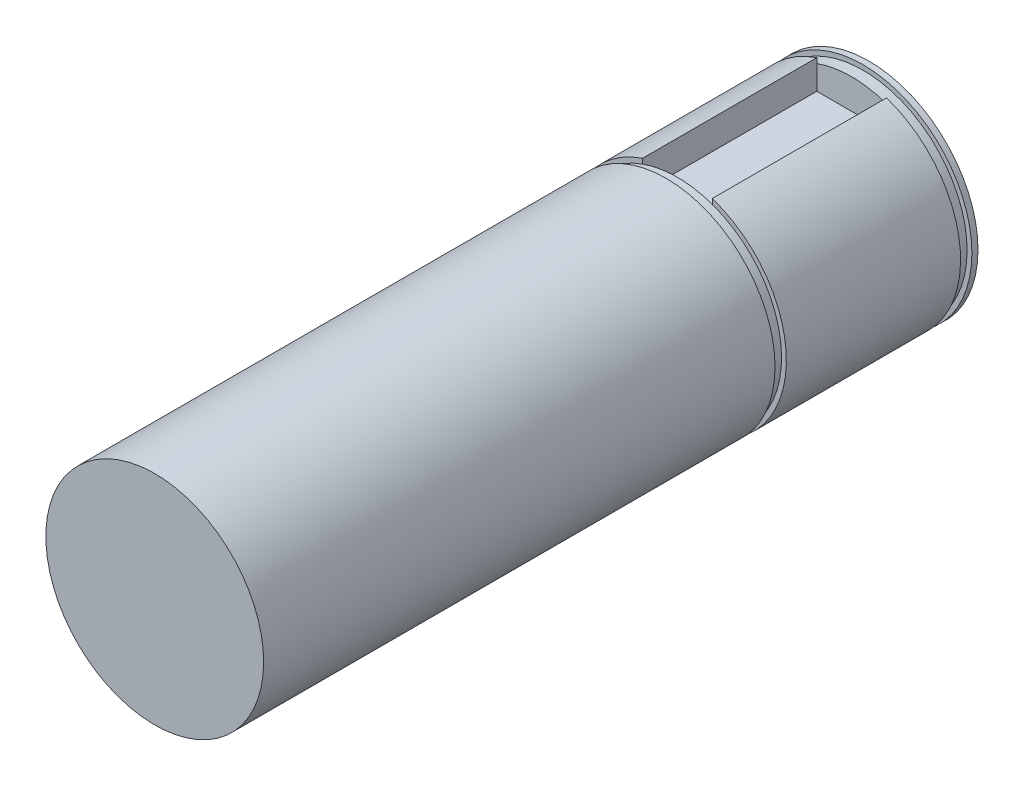
ISO-10303-21;
HEADER;
FILE_DESCRIPTION(('STEP AP214'),'2;1');
FILE_NAME('part.step','',(''),(''),'','','');
FILE_SCHEMA(('AUTOMOTIVE_DESIGN { 1 0 10303 214 1 1 1 1 }'));
ENDSEC;
DATA;
#1=APPLICATION_CONTEXT('core data for automotive mechanical design processes');
#2=APPLICATION_PROTOCOL_DEFINITION('international standard','automotive_design',2000,#1);
#3=PRODUCT_CONTEXT('',#1,'mechanical');
#4=PRODUCT('Part','Part','',(#3));
#5=PRODUCT_RELATED_PRODUCT_CATEGORY('part','',(#4));
#6=PRODUCT_DEFINITION_FORMATION('','',#4);
#7=PRODUCT_DEFINITION_CONTEXT('part definition',#1,'design');
#8=PRODUCT_DEFINITION('design','',#6,#7);
#9=PRODUCT_DEFINITION_SHAPE('','',#8);
#10=(LENGTH_UNIT() NAMED_UNIT(*) SI_UNIT(.MILLI.,.METRE.));
#11=(NAMED_UNIT(*) PLANE_ANGLE_UNIT() SI_UNIT($,.RADIAN.));
#12=(NAMED_UNIT(*) SI_UNIT($,.STERADIAN.) SOLID_ANGLE_UNIT());
#13=UNCERTAINTY_MEASURE_WITH_UNIT(LENGTH_MEASURE(1.E-05),#10,'distance_accuracy_value','');
#14=(GEOMETRIC_REPRESENTATION_CONTEXT(3) GLOBAL_UNCERTAINTY_ASSIGNED_CONTEXT((#13)) GLOBAL_UNIT_ASSIGNED_CONTEXT((#10,
#11,#12)) REPRESENTATION_CONTEXT('',''));
#15=CARTESIAN_POINT('',(0.,0.,0.));
#16=DIRECTION('',(0.,0.,1.));
#17=DIRECTION('',(1.,0.,0.));
#18=AXIS2_PLACEMENT_3D('',#15,#16,#17);
#19=CARTESIAN_POINT('',(0.,0.,-2.));
#20=DIRECTION('',(0.,0.,1.));
#21=DIRECTION('',(1.,0.,0.));
#22=AXIS2_PLACEMENT_3D('',#19,#20,#21);
#23=CYLINDRICAL_SURFACE('',#22,12.5);
#24=CARTESIAN_POINT('',(0.,0.,20.));
#25=DIRECTION('',(0.,0.,-1.));
#26=DIRECTION('',(-1.,0.,0.));
#27=AXIS2_PLACEMENT_3D('',#24,#25,#26);
#28=CIRCLE('',#27,12.5);
#29=CARTESIAN_POINT('',(4.,11.842719282327,20.));
#30=VERTEX_POINT('',#29);
#31=CARTESIAN_POINT('',(-4.,11.842719282327,20.));
#32=VERTEX_POINT('',#31);
#33=EDGE_CURVE('E88',#30,#32,#28,.T.);
#34=ORIENTED_EDGE('',*,*,#33,.T.);
#35=DIRECTION('',(0.,0.,-1.));
#36=VECTOR('',#35,1.);
#37=CARTESIAN_POINT('',(-4.,11.842719282327,20.));
#38=LINE('',#37,#36);
#39=CARTESIAN_POINT('',(-4.,11.842719282327,0.));
#40=VERTEX_POINT('',#39);
#41=EDGE_CURVE('E101',#32,#40,#38,.T.);
#42=ORIENTED_EDGE('',*,*,#41,.T.);
#43=CARTESIAN_POINT('',(0.,0.,0.));
#44=DIRECTION('',(0.,0.,-1.));
#45=DIRECTION('',(-1.,0.,0.));
#46=AXIS2_PLACEMENT_3D('',#43,#44,#45);
#47=CIRCLE('',#46,12.5);
#48=CARTESIAN_POINT('',(4.,11.842719282327,0.));
#49=VERTEX_POINT('',#48);
#50=EDGE_CURVE('E149',#49,#40,#47,.T.);
#51=ORIENTED_EDGE('',*,*,#50,.F.);
#52=DIRECTION('',(0.,0.,-1.));
#53=VECTOR('',#52,1.);
#54=CARTESIAN_POINT('',(4.,11.842719282327,20.));
#55=LINE('',#54,#53);
#56=EDGE_CURVE('E103',#30,#49,#55,.T.);
#57=ORIENTED_EDGE('',*,*,#56,.F.);
#58=EDGE_LOOP('',(#34,#42,#51,#57));
#59=FACE_BOUND('',#58,.T.);
#60=ADVANCED_FACE('F33',(#59),#23,.T.);
#61=CARTESIAN_POINT('',(-4.,8.5,20.));
#62=DIRECTION('',(-1.,0.,0.));
#63=DIRECTION('',(0.,0.,1.));
#64=AXIS2_PLACEMENT_3D('',#61,#62,#63);
#65=PLANE('',#64);
#66=DIRECTION('',(0.,1.,0.));
#67=VECTOR('',#66,1.);
#68=CARTESIAN_POINT('',(-4.,8.5,0.));
#69=LINE('',#68,#67);
#70=CARTESIAN_POINT('',(-4.,8.5,0.));
#71=VERTEX_POINT('',#70);
#72=CARTESIAN_POINT('',(-4.,11.2606616146655,0.));
#73=VERTEX_POINT('',#72);
#74=EDGE_CURVE('E116',#71,#73,#69,.T.);
#75=ORIENTED_EDGE('',*,*,#74,.T.);
#76=EDGE_CURVE('E109',#73,#40,#69,.T.);
#77=ORIENTED_EDGE('',*,*,#76,.T.);
#78=ORIENTED_EDGE('',*,*,#41,.F.);
#79=DIRECTION('',(0.,1.,0.));
#80=VECTOR('',#79,1.);
#81=CARTESIAN_POINT('',(-4.,8.5,20.));
#82=LINE('',#81,#80);
#83=CARTESIAN_POINT('',(-4.,11.2606616146655,20.));
#84=VERTEX_POINT('',#83);
#85=EDGE_CURVE('E85',#84,#32,#82,.T.);
#86=ORIENTED_EDGE('',*,*,#85,.F.);
#87=CARTESIAN_POINT('',(-4.,8.5,20.));
#88=VERTEX_POINT('',#87);
#89=EDGE_CURVE('E94',#88,#84,#82,.T.);
#90=ORIENTED_EDGE('',*,*,#89,.F.);
#91=DIRECTION('',(0.,0.,-1.));
#92=VECTOR('',#91,1.);
#93=CARTESIAN_POINT('',(-4.,8.5,20.));
#94=LINE('',#93,#92);
#95=EDGE_CURVE('E110',#88,#71,#94,.T.);
#96=ORIENTED_EDGE('',*,*,#95,.T.);
#97=EDGE_LOOP('',(#75,#77,#78,#86,#90,#96));
#98=FACE_BOUND('',#97,.T.);
#99=ADVANCED_FACE('F108',(#98),#65,.F.);
#100=CARTESIAN_POINT('',(4.,8.5,20.));
#101=DIRECTION('',(0.,-1.,0.));
#102=DIRECTION('',(0.,0.,-1.));
#103=AXIS2_PLACEMENT_3D('',#100,#101,#102);
#104=PLANE('',#103);
#105=DIRECTION('',(-1.,0.,0.));
#106=VECTOR('',#105,1.);
#107=CARTESIAN_POINT('',(4.,8.5,0.));
#108=LINE('',#107,#106);
#109=CARTESIAN_POINT('',(4.,8.5,0.));
#110=VERTEX_POINT('',#109);
#111=EDGE_CURVE('E130',#110,#71,#108,.T.);
#112=ORIENTED_EDGE('',*,*,#111,.T.);
#113=ORIENTED_EDGE('',*,*,#95,.F.);
#114=DIRECTION('',(-1.,0.,0.));
#115=VECTOR('',#114,1.);
#116=CARTESIAN_POINT('',(4.,8.5,20.));
#117=LINE('',#116,#115);
#118=CARTESIAN_POINT('',(4.,8.5,20.));
#119=VERTEX_POINT('',#118);
#120=EDGE_CURVE('E95',#119,#88,#117,.T.);
#121=ORIENTED_EDGE('',*,*,#120,.F.);
#122=DIRECTION('',(0.,0.,-1.));
#123=VECTOR('',#122,1.);
#124=CARTESIAN_POINT('',(4.,8.5,20.));
#125=LINE('',#124,#123);
#126=EDGE_CURVE('E113',#119,#110,#125,.T.);
#127=ORIENTED_EDGE('',*,*,#126,.T.);
#128=EDGE_LOOP('',(#112,#113,#121,#127));
#129=FACE_BOUND('',#128,.T.);
#130=ADVANCED_FACE('F180',(#129),#104,.F.);
#131=CARTESIAN_POINT('',(4.,11.842719282327,20.));
#132=DIRECTION('',(1.,0.,0.));
#133=DIRECTION('',(0.,0.,-1.));
#134=AXIS2_PLACEMENT_3D('',#131,#132,#133);
#135=PLANE('',#134);
#136=DIRECTION('',(0.,-1.,0.));
#137=VECTOR('',#136,1.);
#138=CARTESIAN_POINT('',(4.,11.842719282327,0.));
#139=LINE('',#138,#137);
#140=CARTESIAN_POINT('',(4.,11.2606616146655,0.));
#141=VERTEX_POINT('',#140);
#142=EDGE_CURVE('E129',#49,#141,#139,.T.);
#143=ORIENTED_EDGE('',*,*,#142,.T.);
#144=EDGE_CURVE('E131',#141,#110,#139,.T.);
#145=ORIENTED_EDGE('',*,*,#144,.T.);
#146=ORIENTED_EDGE('',*,*,#126,.F.);
#147=DIRECTION('',(0.,-1.,0.));
#148=VECTOR('',#147,1.);
#149=CARTESIAN_POINT('',(4.,11.842719282327,20.));
#150=LINE('',#149,#148);
#151=CARTESIAN_POINT('',(4.,11.2606616146654,20.));
#152=VERTEX_POINT('',#151);
#153=EDGE_CURVE('E136',#152,#119,#150,.T.);
#154=ORIENTED_EDGE('',*,*,#153,.F.);
#155=EDGE_CURVE('E137',#30,#152,#150,.T.);
#156=ORIENTED_EDGE('',*,*,#155,.F.);
#157=ORIENTED_EDGE('',*,*,#56,.T.);
#158=EDGE_LOOP('',(#143,#145,#146,#154,#156,#157));
#159=FACE_BOUND('',#158,.T.);
#160=ADVANCED_FACE('F209',(#159),#135,.F.);
#161=CARTESIAN_POINT('',(0.,0.,20.));
#162=DIRECTION('',(0.,0.,1.));
#163=DIRECTION('',(1.,0.,0.));
#164=AXIS2_PLACEMENT_3D('',#161,#162,#163);
#165=PLANE('',#164);
#166=ORIENTED_EDGE('',*,*,#89,.T.);
#167=CARTESIAN_POINT('',(0.,0.,20.));
#168=DIRECTION('',(0.,0.,-1.));
#169=DIRECTION('',(-1.,0.,0.));
#170=AXIS2_PLACEMENT_3D('',#167,#168,#169);
#171=CIRCLE('',#170,11.95);
#172=EDGE_CURVE('E151',#84,#152,#171,.T.);
#173=ORIENTED_EDGE('',*,*,#172,.T.);
#174=ORIENTED_EDGE('',*,*,#153,.T.);
#175=ORIENTED_EDGE('',*,*,#120,.T.);
#176=EDGE_LOOP('',(#166,#173,#174,#175));
#177=FACE_BOUND('',#176,.T.);
#178=ADVANCED_FACE('F216',(#177),#165,.F.);
#179=CARTESIAN_POINT('',(0.,0.,0.));
#180=DIRECTION('',(0.,0.,1.));
#181=DIRECTION('',(1.,0.,0.));
#182=AXIS2_PLACEMENT_3D('',#179,#180,#181);
#183=PLANE('',#182);
#184=CARTESIAN_POINT('',(0.,0.,0.));
#185=DIRECTION('',(0.,0.,-1.));
#186=DIRECTION('',(-1.,0.,0.));
#187=AXIS2_PLACEMENT_3D('',#184,#185,#186);
#188=CIRCLE('',#187,11.95);
#189=EDGE_CURVE('E141',#73,#141,#188,.T.);
#190=ORIENTED_EDGE('',*,*,#189,.F.);
#191=ORIENTED_EDGE('',*,*,#74,.F.);
#192=ORIENTED_EDGE('',*,*,#111,.F.);
#193=ORIENTED_EDGE('',*,*,#144,.F.);
#194=EDGE_LOOP('',(#190,#191,#192,#193));
#195=FACE_BOUND('',#194,.T.);
#196=ADVANCED_FACE('F208',(#195),#183,.T.);
#197=CARTESIAN_POINT('',(0.,12.5,0.));
#198=DIRECTION('',(0.,0.,1.));
#199=DIRECTION('',(1.,0.,0.));
#200=AXIS2_PLACEMENT_3D('',#197,#198,#199);
#201=PLANE('',#200);
#202=EDGE_CURVE('E54',#141,#73,#188,.T.);
#203=ORIENTED_EDGE('',*,*,#202,.F.);
#204=ORIENTED_EDGE('',*,*,#142,.F.);
#205=ORIENTED_EDGE('',*,*,#50,.T.);
#206=ORIENTED_EDGE('',*,*,#76,.F.);
#207=EDGE_LOOP('',(#203,#204,#205,#206));
#208=FACE_BOUND('',#207,.T.);
#209=ADVANCED_FACE('F203',(#208),#201,.F.);
#210=CARTESIAN_POINT('',(0.,0.,-5.56626142299438));
#211=DIRECTION('',(0.,0.,-1.));
#212=DIRECTION('',(-1.,0.,0.));
#213=AXIS2_PLACEMENT_3D('',#210,#211,#212);
#214=CYLINDRICAL_SURFACE('',#213,11.95);
#215=CARTESIAN_POINT('',(0.,0.,-1.3));
#216=DIRECTION('',(0.,0.,-1.));
#217=DIRECTION('',(-1.,0.,0.));
#218=AXIS2_PLACEMENT_3D('',#215,#216,#217);
#219=CIRCLE('',#218,11.95);
#220=CARTESIAN_POINT('',(-11.95,0.,-1.3));
#221=VERTEX_POINT('',#220);
#222=EDGE_CURVE('E143',#221,#221,#219,.T.);
#223=ORIENTED_EDGE('',*,*,#222,.F.);
#224=EDGE_LOOP('',(#223));
#225=FACE_BOUND('',#224,.T.);
#226=ORIENTED_EDGE('',*,*,#189,.T.);
#227=ORIENTED_EDGE('',*,*,#202,.T.);
#228=EDGE_LOOP('',(#226,#227));
#229=FACE_BOUND('',#228,.T.);
#230=ADVANCED_FACE('F198',(#225,#229),#214,.T.);
#231=CARTESIAN_POINT('',(0.,12.5,-1.3));
#232=DIRECTION('',(0.,0.,-1.));
#233=DIRECTION('',(-1.,0.,0.));
#234=AXIS2_PLACEMENT_3D('',#231,#232,#233);
#235=PLANE('',#234);
#236=CARTESIAN_POINT('',(0.,0.,-1.3));
#237=DIRECTION('',(0.,0.,-1.));
#238=DIRECTION('',(-1.,0.,0.));
#239=AXIS2_PLACEMENT_3D('',#236,#237,#238);
#240=CIRCLE('',#239,12.5);
#241=CARTESIAN_POINT('',(-12.5,0.,-1.3));
#242=VERTEX_POINT('',#241);
#243=EDGE_CURVE('E146',#242,#242,#240,.T.);
#244=ORIENTED_EDGE('',*,*,#243,.F.);
#245=EDGE_LOOP('',(#244));
#246=FACE_BOUND('',#245,.T.);
#247=ORIENTED_EDGE('',*,*,#222,.T.);
#248=EDGE_LOOP('',(#247));
#249=FACE_BOUND('',#248,.T.);
#250=ADVANCED_FACE('F190',(#246,#249),#235,.F.);
#251=CARTESIAN_POINT('',(0.,0.,-2.));
#252=DIRECTION('',(0.,0.,1.));
#253=DIRECTION('',(1.,0.,0.));
#254=AXIS2_PLACEMENT_3D('',#251,#252,#253);
#255=PLANE('',#254);
#256=CARTESIAN_POINT('',(0.,0.,-2.));
#257=DIRECTION('',(0.,0.,1.));
#258=DIRECTION('',(1.,0.,0.));
#259=AXIS2_PLACEMENT_3D('',#256,#257,#258);
#260=CIRCLE('',#259,12.5);
#261=CARTESIAN_POINT('',(12.5,0.,-2.));
#262=VERTEX_POINT('',#261);
#263=EDGE_CURVE('E11',#262,#262,#260,.T.);
#264=ORIENTED_EDGE('',*,*,#263,.F.);
#265=EDGE_LOOP('',(#264));
#266=FACE_BOUND('',#265,.T.);
#267=ADVANCED_FACE('F183',(#266),#255,.F.);
#268=ORIENTED_EDGE('',*,*,#243,.T.);
#269=EDGE_LOOP('',(#268));
#270=FACE_BOUND('',#269,.T.);
#271=ORIENTED_EDGE('',*,*,#263,.T.);
#272=EDGE_LOOP('',(#271));
#273=FACE_BOUND('',#272,.T.);
#274=ADVANCED_FACE('F35',(#270,#273),#23,.T.);
#275=CARTESIAN_POINT('',(0.,12.5,20.));
#276=DIRECTION('',(0.,0.,-1.));
#277=DIRECTION('',(-1.,0.,0.));
#278=AXIS2_PLACEMENT_3D('',#275,#276,#277);
#279=PLANE('',#278);
#280=ORIENTED_EDGE('',*,*,#33,.F.);
#281=ORIENTED_EDGE('',*,*,#155,.T.);
#282=EDGE_CURVE('E47',#152,#84,#171,.T.);
#283=ORIENTED_EDGE('',*,*,#282,.T.);
#284=ORIENTED_EDGE('',*,*,#85,.T.);
#285=EDGE_LOOP('',(#280,#281,#283,#284));
#286=FACE_BOUND('',#285,.T.);
#287=ADVANCED_FACE('F87',(#286),#279,.F.);
#288=CARTESIAN_POINT('',(0.,0.,0.));
#289=DIRECTION('',(0.,0.,-1.));
#290=DIRECTION('',(-1.,0.,0.));
#291=AXIS2_PLACEMENT_3D('',#288,#289,#290);
#292=CYLINDRICAL_SURFACE('',#291,11.95);
#293=ORIENTED_EDGE('',*,*,#172,.F.);
#294=ORIENTED_EDGE('',*,*,#282,.F.);
#295=EDGE_LOOP('',(#293,#294));
#296=FACE_BOUND('',#295,.T.);
#297=CARTESIAN_POINT('',(0.,0.,21.3));
#298=DIRECTION('',(0.,0.,-1.));
#299=DIRECTION('',(-1.,0.,0.));
#300=AXIS2_PLACEMENT_3D('',#297,#298,#299);
#301=CIRCLE('',#300,11.95);
#302=CARTESIAN_POINT('',(-11.95,0.,21.3));
#303=VERTEX_POINT('',#302);
#304=EDGE_CURVE('E153',#303,#303,#301,.T.);
#305=ORIENTED_EDGE('',*,*,#304,.T.);
#306=EDGE_LOOP('',(#305));
#307=FACE_BOUND('',#306,.T.);
#308=ADVANCED_FACE('F172',(#296,#307),#292,.T.);
#309=CARTESIAN_POINT('',(0.,12.5,21.3));
#310=DIRECTION('',(0.,0.,1.));
#311=DIRECTION('',(1.,0.,0.));
#312=AXIS2_PLACEMENT_3D('',#309,#310,#311);
#313=PLANE('',#312);
#314=ORIENTED_EDGE('',*,*,#304,.F.);
#315=EDGE_LOOP('',(#314));
#316=FACE_BOUND('',#315,.T.);
#317=CARTESIAN_POINT('',(0.,0.,21.3));
#318=DIRECTION('',(0.,0.,-1.));
#319=DIRECTION('',(-1.,0.,0.));
#320=AXIS2_PLACEMENT_3D('',#317,#318,#319);
#321=CIRCLE('',#320,12.5);
#322=CARTESIAN_POINT('',(-12.5,0.,21.3));
#323=VERTEX_POINT('',#322);
#324=EDGE_CURVE('E104',#323,#323,#321,.T.);
#325=ORIENTED_EDGE('',*,*,#324,.T.);
#326=EDGE_LOOP('',(#325));
#327=FACE_BOUND('',#326,.T.);
#328=ADVANCED_FACE('F159',(#316,#327),#313,.F.);
#329=CARTESIAN_POINT('',(0.,0.,80.));
#330=DIRECTION('',(0.,0.,1.));
#331=DIRECTION('',(1.,0.,0.));
#332=AXIS2_PLACEMENT_3D('',#329,#330,#331);
#333=PLANE('',#332);
#334=CARTESIAN_POINT('',(0.,0.,80.));
#335=DIRECTION('',(0.,0.,1.));
#336=DIRECTION('',(1.,0.,0.));
#337=AXIS2_PLACEMENT_3D('',#334,#335,#336);
#338=CIRCLE('',#337,12.5);
#339=CARTESIAN_POINT('',(12.5,0.,80.));
#340=VERTEX_POINT('',#339);
#341=EDGE_CURVE('E41',#340,#340,#338,.T.);
#342=ORIENTED_EDGE('',*,*,#341,.T.);
#343=EDGE_LOOP('',(#342));
#344=FACE_BOUND('',#343,.T.);
#345=ADVANCED_FACE('F164',(#344),#333,.T.);
#346=ORIENTED_EDGE('',*,*,#324,.F.);
#347=EDGE_LOOP('',(#346));
#348=FACE_BOUND('',#347,.T.);
#349=ORIENTED_EDGE('',*,*,#341,.F.);
#350=EDGE_LOOP('',(#349));
#351=FACE_BOUND('',#350,.T.);
#352=ADVANCED_FACE('F161',(#348,#351),#23,.T.);
#353=CLOSED_SHELL('',(#60,#99,#130,#160,#178,#196,#209,#230,#250,#267,#274,#287,#308,#328,#345,#352));
#354=MANIFOLD_SOLID_BREP('B2',#353);
#355=ADVANCED_BREP_SHAPE_REPRESENTATION('',(#18,#354),#14);
#356=SHAPE_DEFINITION_REPRESENTATION(#9,#355);
ENDSEC;
END-ISO-10303-21;
